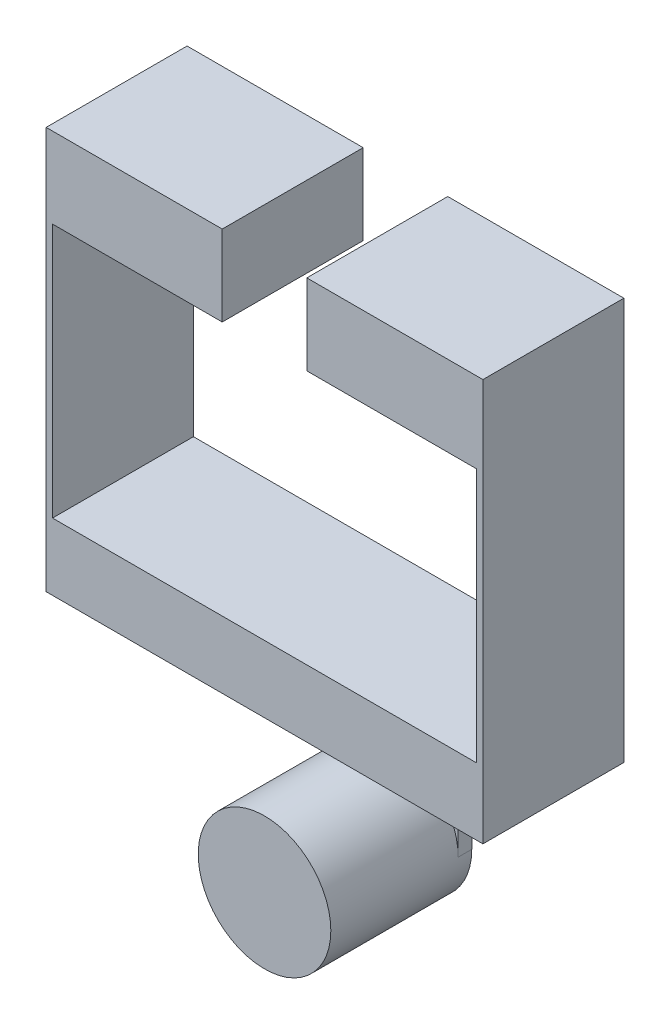
ISO-10303-21;
HEADER;
FILE_DESCRIPTION(('STEP AP214'),'2;1');
FILE_NAME('part.step','',(''),(''),'','','');
FILE_SCHEMA(('AUTOMOTIVE_DESIGN { 1 0 10303 214 1 1 1 1 }'));
ENDSEC;
DATA;
#1=APPLICATION_CONTEXT('core data for automotive mechanical design processes');
#2=APPLICATION_PROTOCOL_DEFINITION('international standard','automotive_design',2000,#1);
#3=PRODUCT_CONTEXT('',#1,'mechanical');
#4=PRODUCT('Part','Part','',(#3));
#5=PRODUCT_RELATED_PRODUCT_CATEGORY('part','',(#4));
#6=PRODUCT_DEFINITION_FORMATION('','',#4);
#7=PRODUCT_DEFINITION_CONTEXT('part definition',#1,'design');
#8=PRODUCT_DEFINITION('design','',#6,#7);
#9=PRODUCT_DEFINITION_SHAPE('','',#8);
#10=(LENGTH_UNIT() NAMED_UNIT(*) SI_UNIT(.MILLI.,.METRE.));
#11=(NAMED_UNIT(*) PLANE_ANGLE_UNIT() SI_UNIT($,.RADIAN.));
#12=(NAMED_UNIT(*) SI_UNIT($,.STERADIAN.) SOLID_ANGLE_UNIT());
#13=UNCERTAINTY_MEASURE_WITH_UNIT(LENGTH_MEASURE(1.E-05),#10,'distance_accuracy_value','');
#14=(GEOMETRIC_REPRESENTATION_CONTEXT(3) GLOBAL_UNCERTAINTY_ASSIGNED_CONTEXT((#13)) GLOBAL_UNIT_ASSIGNED_CONTEXT((#10,
#11,#12)) REPRESENTATION_CONTEXT('',''));
#15=CARTESIAN_POINT('',(0.,0.,0.));
#16=DIRECTION('',(0.,0.,1.));
#17=DIRECTION('',(1.,0.,0.));
#18=AXIS2_PLACEMENT_3D('',#15,#16,#17);
#19=CARTESIAN_POINT('',(-31.70428,70.7017928379302,0.));
#20=DIRECTION('',(-1.,0.,0.));
#21=DIRECTION('',(0.,0.,1.));
#22=AXIS2_PLACEMENT_3D('',#19,#20,#21);
#23=PLANE('',#22);
#24=DIRECTION('',(0.,0.,-1.));
#25=VECTOR('',#24,1.);
#26=CARTESIAN_POINT('',(-31.70428,70.7017928379302,0.));
#27=LINE('',#26,#25);
#28=CARTESIAN_POINT('',(-31.70428,70.7017928379302,21.0747443563726));
#29=VERTEX_POINT('',#28);
#30=CARTESIAN_POINT('',(-31.70428,70.7017928379302,0.));
#31=VERTEX_POINT('',#30);
#32=EDGE_CURVE('E65',#29,#31,#27,.T.);
#33=ORIENTED_EDGE('',*,*,#32,.F.);
#34=DIRECTION('',(0.,-1.,0.));
#35=VECTOR('',#34,1.);
#36=CARTESIAN_POINT('',(-31.70428,70.7017928379302,21.0747443563726));
#37=LINE('',#36,#35);
#38=CARTESIAN_POINT('',(-31.70428,32.6271928379302,21.0747443563726));
#39=VERTEX_POINT('',#38);
#40=EDGE_CURVE('E186',#29,#39,#37,.T.);
#41=ORIENTED_EDGE('',*,*,#40,.T.);
#42=DIRECTION('',(0.,0.,-1.));
#43=VECTOR('',#42,1.);
#44=CARTESIAN_POINT('',(-31.70428,32.6271928379302,0.));
#45=LINE('',#44,#43);
#46=CARTESIAN_POINT('',(-31.70428,32.6271928379302,0.));
#47=VERTEX_POINT('',#46);
#48=EDGE_CURVE('E203',#39,#47,#45,.T.);
#49=ORIENTED_EDGE('',*,*,#48,.T.);
#50=DIRECTION('',(0.,-1.,0.));
#51=VECTOR('',#50,1.);
#52=CARTESIAN_POINT('',(-31.70428,70.7017928379302,0.));
#53=LINE('',#52,#51);
#54=EDGE_CURVE('E70',#31,#47,#53,.T.);
#55=ORIENTED_EDGE('',*,*,#54,.F.);
#56=EDGE_LOOP('',(#33,#41,#49,#55));
#57=FACE_BOUND('',#56,.T.);
#58=ADVANCED_FACE('F49',(#57),#23,.F.);
#59=CARTESIAN_POINT('',(0.,32.6271928379302,0.));
#60=DIRECTION('',(0.,1.,0.));
#61=DIRECTION('',(0.,0.,1.));
#62=AXIS2_PLACEMENT_3D('',#59,#60,#61);
#63=PLANE('',#62);
#64=DIRECTION('',(-1.,0.,0.));
#65=VECTOR('',#64,1.);
#66=CARTESIAN_POINT('',(-31.70428,32.6271928379302,0.));
#67=LINE('',#66,#65);
#68=CARTESIAN_POINT('',(31.70428,32.6271928379302,0.));
#69=VERTEX_POINT('',#68);
#70=EDGE_CURVE('E280',#69,#47,#67,.T.);
#71=ORIENTED_EDGE('',*,*,#70,.T.);
#72=ORIENTED_EDGE('',*,*,#48,.F.);
#73=DIRECTION('',(1.,0.,0.));
#74=VECTOR('',#73,1.);
#75=CARTESIAN_POINT('',(-31.70428,32.6271928379302,21.0747443563726));
#76=LINE('',#75,#74);
#77=CARTESIAN_POINT('',(31.70428,32.6271928379302,21.0747443563726));
#78=VERTEX_POINT('',#77);
#79=EDGE_CURVE('E284',#39,#78,#76,.T.);
#80=ORIENTED_EDGE('',*,*,#79,.T.);
#81=DIRECTION('',(0.,0.,-1.));
#82=VECTOR('',#81,1.);
#83=CARTESIAN_POINT('',(31.70428,32.6271928379302,0.));
#84=LINE('',#83,#82);
#85=EDGE_CURVE('E258',#78,#69,#84,.T.);
#86=ORIENTED_EDGE('',*,*,#85,.T.);
#87=EDGE_LOOP('',(#71,#72,#80,#86));
#88=FACE_BOUND('',#87,.T.);
#89=ADVANCED_FACE('F449',(#88),#63,.T.);
#90=CARTESIAN_POINT('',(0.,0.,21.0747443563726));
#91=DIRECTION('',(0.,0.,-1.));
#92=DIRECTION('',(-1.,0.,0.));
#93=AXIS2_PLACEMENT_3D('',#90,#91,#92);
#94=CYLINDRICAL_SURFACE('',#93,9.91317465894993);
#95=CARTESIAN_POINT('',(0.,0.,21.0747443563726));
#96=DIRECTION('',(0.,0.,1.));
#97=DIRECTION('',(1.,0.,0.));
#98=AXIS2_PLACEMENT_3D('',#95,#96,#97);
#99=CIRCLE('',#98,9.91317465894993);
#100=CARTESIAN_POINT('',(9.91317465894993,0.,21.0747443563726));
#101=VERTEX_POINT('',#100);
#102=EDGE_CURVE('E58',#101,#101,#99,.T.);
#103=ORIENTED_EDGE('',*,*,#102,.F.);
#104=EDGE_LOOP('',(#103));
#105=FACE_BOUND('',#104,.T.);
#106=CARTESIAN_POINT('',(0.,0.,2.02474435637258));
#107=DIRECTION('',(0.,0.,-1.));
#108=DIRECTION('',(-1.,0.,0.));
#109=AXIS2_PLACEMENT_3D('',#106,#107,#108);
#110=CIRCLE('',#109,9.91317465894993);
#111=CARTESIAN_POINT('',(-9.91317465894993,0.,2.02474435637258));
#112=VERTEX_POINT('',#111);
#113=CARTESIAN_POINT('',(9.91317465894993,0.,2.02474435637258));
#114=VERTEX_POINT('',#113);
#115=EDGE_CURVE('E11',#112,#114,#110,.T.);
#116=ORIENTED_EDGE('',*,*,#115,.F.);
#117=DIRECTION('',(0.,0.,-1.));
#118=VECTOR('',#117,1.);
#119=CARTESIAN_POINT('',(-9.91317465894993,0.,2.02474435637258));
#120=LINE('',#119,#118);
#121=CARTESIAN_POINT('',(-9.91317465894993,0.,0.));
#122=VERTEX_POINT('',#121);
#123=EDGE_CURVE('E322',#112,#122,#120,.T.);
#124=ORIENTED_EDGE('',*,*,#123,.T.);
#125=CARTESIAN_POINT('',(0.,0.,0.));
#126=DIRECTION('',(0.,0.,1.));
#127=DIRECTION('',(1.,0.,0.));
#128=AXIS2_PLACEMENT_3D('',#125,#126,#127);
#129=CIRCLE('',#128,9.91317465894993);
#130=CARTESIAN_POINT('',(9.91317465894993,0.,0.));
#131=VERTEX_POINT('',#130);
#132=EDGE_CURVE('E318',#122,#131,#129,.T.);
#133=ORIENTED_EDGE('',*,*,#132,.T.);
#134=DIRECTION('',(0.,0.,-1.));
#135=VECTOR('',#134,1.);
#136=CARTESIAN_POINT('',(9.91317465894993,0.,2.02474435637258));
#137=LINE('',#136,#135);
#138=EDGE_CURVE('E307',#114,#131,#137,.T.);
#139=ORIENTED_EDGE('',*,*,#138,.F.);
#140=EDGE_LOOP('',(#116,#124,#133,#139));
#141=FACE_BOUND('',#140,.T.);
#142=ADVANCED_FACE('F51',(#105,#141),#94,.T.);
#143=CARTESIAN_POINT('',(0.,0.,21.0747443563726));
#144=DIRECTION('',(0.,0.,1.));
#145=DIRECTION('',(1.,0.,0.));
#146=AXIS2_PLACEMENT_3D('',#143,#144,#145);
#147=PLANE('',#146);
#148=ORIENTED_EDGE('',*,*,#102,.T.);
#149=EDGE_LOOP('',(#148));
#150=FACE_BOUND('',#149,.T.);
#151=ADVANCED_FACE('F487',(#150),#147,.T.);
#152=CARTESIAN_POINT('',(0.,0.,0.));
#153=DIRECTION('',(0.,0.,1.));
#154=DIRECTION('',(1.,0.,0.));
#155=AXIS2_PLACEMENT_3D('',#152,#153,#154);
#156=PLANE('',#155);
#157=DIRECTION('',(-1.,0.,0.));
#158=VECTOR('',#157,1.);
#159=CARTESIAN_POINT('',(-31.70428,22.6131746589499,0.));
#160=LINE('',#159,#158);
#161=CARTESIAN_POINT('',(-9.91317465894993,22.6131746589499,0.));
#162=VERTEX_POINT('',#161);
#163=CARTESIAN_POINT('',(-32.6566827482865,22.6131746589499,0.));
#164=VERTEX_POINT('',#163);
#165=EDGE_CURVE('E274',#162,#164,#160,.T.);
#166=ORIENTED_EDGE('',*,*,#165,.T.);
#167=DIRECTION('',(0.,1.,0.));
#168=VECTOR('',#167,1.);
#169=CARTESIAN_POINT('',(-32.6566827482865,1.51692094694216,0.));
#170=LINE('',#169,#168);
#171=CARTESIAN_POINT('',(-32.6566827482865,82.7446356043119,0.));
#172=VERTEX_POINT('',#171);
#173=EDGE_CURVE('E218',#164,#172,#170,.T.);
#174=ORIENTED_EDGE('',*,*,#173,.T.);
#175=DIRECTION('',(1.,0.,0.));
#176=VECTOR('',#175,1.);
#177=CARTESIAN_POINT('',(-120.338168232913,82.7446356043119,0.));
#178=LINE('',#177,#176);
#179=CARTESIAN_POINT('',(-6.32460000000002,82.7446356043119,0.));
#180=VERTEX_POINT('',#179);
#181=EDGE_CURVE('E188',#172,#180,#178,.T.);
#182=ORIENTED_EDGE('',*,*,#181,.T.);
#183=DIRECTION('',(0.,1.,0.));
#184=VECTOR('',#183,1.);
#185=CARTESIAN_POINT('',(-6.32460000000002,0.,-2.53492376288285E-13));
#186=LINE('',#185,#184);
#187=CARTESIAN_POINT('',(-6.32460000000002,70.7017928379302,0.));
#188=VERTEX_POINT('',#187);
#189=EDGE_CURVE('E172',#188,#180,#186,.T.);
#190=ORIENTED_EDGE('',*,*,#189,.F.);
#191=DIRECTION('',(-1.,0.,0.));
#192=VECTOR('',#191,1.);
#193=CARTESIAN_POINT('',(-6.32460000000002,70.7017928379302,0.));
#194=LINE('',#193,#192);
#195=EDGE_CURVE('E167',#188,#31,#194,.T.);
#196=ORIENTED_EDGE('',*,*,#195,.T.);
#197=ORIENTED_EDGE('',*,*,#54,.T.);
#198=ORIENTED_EDGE('',*,*,#70,.F.);
#199=DIRECTION('',(0.,-1.,0.));
#200=VECTOR('',#199,1.);
#201=CARTESIAN_POINT('',(31.70428,70.7017928379302,0.));
#202=LINE('',#201,#200);
#203=CARTESIAN_POINT('',(31.70428,70.7017928379302,0.));
#204=VERTEX_POINT('',#203);
#205=EDGE_CURVE('E266',#204,#69,#202,.T.);
#206=ORIENTED_EDGE('',*,*,#205,.F.);
#207=DIRECTION('',(1.,0.,0.));
#208=VECTOR('',#207,1.);
#209=CARTESIAN_POINT('',(6.32460000000002,70.7017928379302,0.));
#210=LINE('',#209,#208);
#211=CARTESIAN_POINT('',(6.32460000000002,70.7017928379302,0.));
#212=VERTEX_POINT('',#211);
#213=EDGE_CURVE('E245',#212,#204,#210,.T.);
#214=ORIENTED_EDGE('',*,*,#213,.F.);
#215=DIRECTION('',(0.,1.,0.));
#216=VECTOR('',#215,1.);
#217=CARTESIAN_POINT('',(6.32460000000002,0.,-2.53492376288285E-13));
#218=LINE('',#217,#216);
#219=CARTESIAN_POINT('',(6.32460000000002,82.7446356043119,0.));
#220=VERTEX_POINT('',#219);
#221=EDGE_CURVE('E231',#212,#220,#218,.T.);
#222=ORIENTED_EDGE('',*,*,#221,.T.);
#223=DIRECTION('',(-1.,0.,0.));
#224=VECTOR('',#223,1.);
#225=CARTESIAN_POINT('',(56.9296082329133,82.7446356043119,0.));
#226=LINE('',#225,#224);
#227=CARTESIAN_POINT('',(32.6566827482865,82.7446356043119,0.));
#228=VERTEX_POINT('',#227);
#229=EDGE_CURVE('E249',#228,#220,#226,.T.);
#230=ORIENTED_EDGE('',*,*,#229,.F.);
#231=DIRECTION('',(0.,1.,0.));
#232=VECTOR('',#231,1.);
#233=CARTESIAN_POINT('',(32.6566827482865,1.51692094694216,0.));
#234=LINE('',#233,#232);
#235=CARTESIAN_POINT('',(32.6566827482865,22.6131746589499,0.));
#236=VERTEX_POINT('',#235);
#237=EDGE_CURVE('E269',#236,#228,#234,.T.);
#238=ORIENTED_EDGE('',*,*,#237,.F.);
#239=CARTESIAN_POINT('',(9.91317465894993,22.6131746589499,0.));
#240=VERTEX_POINT('',#239);
#241=EDGE_CURVE('E289',#236,#240,#160,.T.);
#242=ORIENTED_EDGE('',*,*,#241,.T.);
#243=DIRECTION('',(0.,-1.,0.));
#244=VECTOR('',#243,1.);
#245=CARTESIAN_POINT('',(9.91317465894993,22.6131746589499,0.));
#246=LINE('',#245,#244);
#247=EDGE_CURVE('E288',#240,#131,#246,.T.);
#248=ORIENTED_EDGE('',*,*,#247,.T.);
#249=ORIENTED_EDGE('',*,*,#132,.F.);
#250=DIRECTION('',(0.,1.,0.));
#251=VECTOR('',#250,1.);
#252=CARTESIAN_POINT('',(-9.91317465894993,0.,0.));
#253=LINE('',#252,#251);
#254=EDGE_CURVE('E300',#122,#162,#253,.T.);
#255=ORIENTED_EDGE('',*,*,#254,.T.);
#256=EDGE_LOOP('',(#166,#174,#182,#190,#196,#197,#198,#206,#214,#222,#230,#238,#242,#248,#249,#255));
#257=FACE_BOUND('',#256,.T.);
#258=ADVANCED_FACE('F341',(#257),#156,.F.);
#259=CARTESIAN_POINT('',(9.91317465894993,22.6131746589499,2.02474435637258));
#260=DIRECTION('',(1.,0.,0.));
#261=DIRECTION('',(0.,1.,0.));
#262=AXIS2_PLACEMENT_3D('',#259,#260,#261);
#263=PLANE('',#262);
#264=ORIENTED_EDGE('',*,*,#247,.F.);
#265=DIRECTION('',(0.,0.,-1.));
#266=VECTOR('',#265,1.);
#267=CARTESIAN_POINT('',(9.91317465894993,22.6131746589499,2.02474435637258));
#268=LINE('',#267,#266);
#269=CARTESIAN_POINT('',(9.91317465894993,22.6131746589499,2.02474435637258));
#270=VERTEX_POINT('',#269);
#271=EDGE_CURVE('E314',#270,#240,#268,.T.);
#272=ORIENTED_EDGE('',*,*,#271,.F.);
#273=DIRECTION('',(0.,-1.,0.));
#274=VECTOR('',#273,1.);
#275=CARTESIAN_POINT('',(9.91317465894993,22.6131746589499,2.02474435637258));
#276=LINE('',#275,#274);
#277=EDGE_CURVE('E295',#270,#114,#276,.T.);
#278=ORIENTED_EDGE('',*,*,#277,.T.);
#279=ORIENTED_EDGE('',*,*,#138,.T.);
#280=EDGE_LOOP('',(#264,#272,#278,#279));
#281=FACE_BOUND('',#280,.T.);
#282=ADVANCED_FACE('F339',(#281),#263,.T.);
#283=CARTESIAN_POINT('',(-9.91317465894993,0.,2.02474435637258));
#284=DIRECTION('',(-1.,0.,0.));
#285=DIRECTION('',(0.,-1.,0.));
#286=AXIS2_PLACEMENT_3D('',#283,#284,#285);
#287=PLANE('',#286);
#288=ORIENTED_EDGE('',*,*,#254,.F.);
#289=ORIENTED_EDGE('',*,*,#123,.F.);
#290=DIRECTION('',(0.,1.,0.));
#291=VECTOR('',#290,1.);
#292=CARTESIAN_POINT('',(-9.91317465894993,0.,2.02474435637258));
#293=LINE('',#292,#291);
#294=CARTESIAN_POINT('',(-9.91317465894993,22.6131746589499,2.02474435637258));
#295=VERTEX_POINT('',#294);
#296=EDGE_CURVE('E299',#112,#295,#293,.T.);
#297=ORIENTED_EDGE('',*,*,#296,.T.);
#298=DIRECTION('',(0.,0.,-1.));
#299=VECTOR('',#298,1.);
#300=CARTESIAN_POINT('',(-9.91317465894993,22.6131746589499,2.02474435637258));
#301=LINE('',#300,#299);
#302=EDGE_CURVE('E319',#295,#162,#301,.T.);
#303=ORIENTED_EDGE('',*,*,#302,.T.);
#304=EDGE_LOOP('',(#288,#289,#297,#303));
#305=FACE_BOUND('',#304,.T.);
#306=ADVANCED_FACE('F480',(#305),#287,.T.);
#307=CARTESIAN_POINT('',(0.,0.,2.02474435637258));
#308=DIRECTION('',(0.,0.,-1.));
#309=DIRECTION('',(-1.,0.,0.));
#310=AXIS2_PLACEMENT_3D('',#307,#308,#309);
#311=PLANE('',#310);
#312=ORIENTED_EDGE('',*,*,#296,.F.);
#313=ORIENTED_EDGE('',*,*,#115,.T.);
#314=ORIENTED_EDGE('',*,*,#277,.F.);
#315=DIRECTION('',(1.,0.,0.));
#316=VECTOR('',#315,1.);
#317=CARTESIAN_POINT('',(-9.91317465894993,22.6131746589499,2.02474435637258));
#318=LINE('',#317,#316);
#319=EDGE_CURVE('E303',#295,#270,#318,.T.);
#320=ORIENTED_EDGE('',*,*,#319,.F.);
#321=EDGE_LOOP('',(#312,#313,#314,#320));
#322=FACE_BOUND('',#321,.T.);
#323=ADVANCED_FACE('F477',(#322),#311,.F.);
#324=CARTESIAN_POINT('',(-31.70428,32.6271928379302,21.0747443563726));
#325=DIRECTION('',(0.,0.,-1.));
#326=DIRECTION('',(-1.,0.,0.));
#327=AXIS2_PLACEMENT_3D('',#324,#325,#326);
#328=PLANE('',#327);
#329=ORIENTED_EDGE('',*,*,#79,.F.);
#330=ORIENTED_EDGE('',*,*,#40,.F.);
#331=DIRECTION('',(-1.,0.,0.));
#332=VECTOR('',#331,1.);
#333=CARTESIAN_POINT('',(-6.32460000000001,70.7017928379302,21.0747443563726));
#334=LINE('',#333,#332);
#335=CARTESIAN_POINT('',(-6.32460000000001,70.7017928379302,21.0747443563726));
#336=VERTEX_POINT('',#335);
#337=EDGE_CURVE('E165',#336,#29,#334,.T.);
#338=ORIENTED_EDGE('',*,*,#337,.F.);
#339=DIRECTION('',(0.,-1.,0.));
#340=VECTOR('',#339,1.);
#341=CARTESIAN_POINT('',(-6.32460000000001,0.,21.0747443563726));
#342=LINE('',#341,#340);
#343=CARTESIAN_POINT('',(-6.32460000000001,82.7446356043119,21.0747443563726));
#344=VERTEX_POINT('',#343);
#345=EDGE_CURVE('E173',#344,#336,#342,.T.);
#346=ORIENTED_EDGE('',*,*,#345,.F.);
#347=DIRECTION('',(1.,0.,0.));
#348=VECTOR('',#347,1.);
#349=CARTESIAN_POINT('',(-120.338168232913,82.7446356043119,21.0747443563726));
#350=LINE('',#349,#348);
#351=CARTESIAN_POINT('',(-32.6566827482865,82.7446356043119,21.0747443563726));
#352=VERTEX_POINT('',#351);
#353=EDGE_CURVE('E194',#352,#344,#350,.T.);
#354=ORIENTED_EDGE('',*,*,#353,.F.);
#355=DIRECTION('',(0.,1.,0.));
#356=VECTOR('',#355,1.);
#357=CARTESIAN_POINT('',(-32.6566827482865,1.51692094694216,21.0747443563726));
#358=LINE('',#357,#356);
#359=CARTESIAN_POINT('',(-32.6566827482865,22.6131746589499,21.0747443563726));
#360=VERTEX_POINT('',#359);
#361=EDGE_CURVE('E212',#360,#352,#358,.T.);
#362=ORIENTED_EDGE('',*,*,#361,.F.);
#363=DIRECTION('',(1.,0.,0.));
#364=VECTOR('',#363,1.);
#365=CARTESIAN_POINT('',(-31.70428,22.6131746589499,21.0747443563726));
#366=LINE('',#365,#364);
#367=CARTESIAN_POINT('',(32.6566827482865,22.6131746589499,21.0747443563726));
#368=VERTEX_POINT('',#367);
#369=EDGE_CURVE('E285',#360,#368,#366,.T.);
#370=ORIENTED_EDGE('',*,*,#369,.T.);
#371=DIRECTION('',(0.,1.,0.));
#372=VECTOR('',#371,1.);
#373=CARTESIAN_POINT('',(32.6566827482865,1.51692094694216,21.0747443563726));
#374=LINE('',#373,#372);
#375=CARTESIAN_POINT('',(32.6566827482865,82.7446356043119,21.0747443563726));
#376=VERTEX_POINT('',#375);
#377=EDGE_CURVE('E275',#368,#376,#374,.T.);
#378=ORIENTED_EDGE('',*,*,#377,.T.);
#379=DIRECTION('',(-1.,0.,0.));
#380=VECTOR('',#379,1.);
#381=CARTESIAN_POINT('',(56.9296082329133,82.7446356043119,21.0747443563726));
#382=LINE('',#381,#380);
#383=CARTESIAN_POINT('',(6.32460000000001,82.7446356043119,21.0747443563726));
#384=VERTEX_POINT('',#383);
#385=EDGE_CURVE('E248',#376,#384,#382,.T.);
#386=ORIENTED_EDGE('',*,*,#385,.T.);
#387=DIRECTION('',(0.,-1.,0.));
#388=VECTOR('',#387,1.);
#389=CARTESIAN_POINT('',(6.32460000000001,0.,21.0747443563726));
#390=LINE('',#389,#388);
#391=CARTESIAN_POINT('',(6.32460000000001,70.7017928379302,21.0747443563726));
#392=VERTEX_POINT('',#391);
#393=EDGE_CURVE('E223',#384,#392,#390,.T.);
#394=ORIENTED_EDGE('',*,*,#393,.T.);
#395=DIRECTION('',(1.,0.,0.));
#396=VECTOR('',#395,1.);
#397=CARTESIAN_POINT('',(6.32460000000001,70.7017928379302,21.0747443563726));
#398=LINE('',#397,#396);
#399=CARTESIAN_POINT('',(31.70428,70.7017928379302,21.0747443563726));
#400=VERTEX_POINT('',#399);
#401=EDGE_CURVE('E239',#392,#400,#398,.T.);
#402=ORIENTED_EDGE('',*,*,#401,.T.);
#403=DIRECTION('',(0.,-1.,0.));
#404=VECTOR('',#403,1.);
#405=CARTESIAN_POINT('',(31.70428,70.7017928379302,21.0747443563726));
#406=LINE('',#405,#404);
#407=EDGE_CURVE('E262',#400,#78,#406,.T.);
#408=ORIENTED_EDGE('',*,*,#407,.T.);
#409=EDGE_LOOP('',(#329,#330,#338,#346,#354,#362,#370,#378,#386,#394,#402,#408));
#410=FACE_BOUND('',#409,.T.);
#411=ADVANCED_FACE('F185',(#410),#328,.F.);
#412=CARTESIAN_POINT('',(0.,22.6131746589499,0.));
#413=DIRECTION('',(0.,1.,0.));
#414=DIRECTION('',(0.,0.,1.));
#415=AXIS2_PLACEMENT_3D('',#412,#413,#414);
#416=PLANE('',#415);
#417=DIRECTION('',(0.,0.,-1.));
#418=VECTOR('',#417,1.);
#419=CARTESIAN_POINT('',(32.6566827482865,22.6131746589499,0.));
#420=LINE('',#419,#418);
#421=EDGE_CURVE('E270',#368,#236,#420,.T.);
#422=ORIENTED_EDGE('',*,*,#421,.F.);
#423=ORIENTED_EDGE('',*,*,#369,.F.);
#424=DIRECTION('',(0.,0.,-1.));
#425=VECTOR('',#424,1.);
#426=CARTESIAN_POINT('',(-32.6566827482865,22.6131746589499,0.));
#427=LINE('',#426,#425);
#428=EDGE_CURVE('E213',#360,#164,#427,.T.);
#429=ORIENTED_EDGE('',*,*,#428,.T.);
#430=ORIENTED_EDGE('',*,*,#165,.F.);
#431=ORIENTED_EDGE('',*,*,#302,.F.);
#432=ORIENTED_EDGE('',*,*,#319,.T.);
#433=ORIENTED_EDGE('',*,*,#271,.T.);
#434=ORIENTED_EDGE('',*,*,#241,.F.);
#435=EDGE_LOOP('',(#422,#423,#429,#430,#431,#432,#433,#434));
#436=FACE_BOUND('',#435,.T.);
#437=ADVANCED_FACE('F346',(#436),#416,.F.);
#438=CARTESIAN_POINT('',(32.6566827482865,1.51692094694216,0.));
#439=DIRECTION('',(-1.,0.,0.));
#440=DIRECTION('',(0.,0.,1.));
#441=AXIS2_PLACEMENT_3D('',#438,#439,#440);
#442=PLANE('',#441);
#443=ORIENTED_EDGE('',*,*,#377,.F.);
#444=ORIENTED_EDGE('',*,*,#421,.T.);
#445=ORIENTED_EDGE('',*,*,#237,.T.);
#446=DIRECTION('',(0.,0.,-1.));
#447=VECTOR('',#446,1.);
#448=CARTESIAN_POINT('',(32.6566827482865,82.7446356043119,0.));
#449=LINE('',#448,#447);
#450=EDGE_CURVE('E252',#376,#228,#449,.T.);
#451=ORIENTED_EDGE('',*,*,#450,.F.);
#452=EDGE_LOOP('',(#443,#444,#445,#451));
#453=FACE_BOUND('',#452,.T.);
#454=ADVANCED_FACE('F349',(#453),#442,.F.);
#455=CARTESIAN_POINT('',(31.70428,70.7017928379302,0.));
#456=DIRECTION('',(-1.,0.,0.));
#457=DIRECTION('',(0.,0.,1.));
#458=AXIS2_PLACEMENT_3D('',#455,#456,#457);
#459=PLANE('',#458);
#460=DIRECTION('',(0.,0.,-1.));
#461=VECTOR('',#460,1.);
#462=CARTESIAN_POINT('',(31.70428,70.7017928379302,0.));
#463=LINE('',#462,#461);
#464=EDGE_CURVE('E217',#400,#204,#463,.T.);
#465=ORIENTED_EDGE('',*,*,#464,.T.);
#466=ORIENTED_EDGE('',*,*,#205,.T.);
#467=ORIENTED_EDGE('',*,*,#85,.F.);
#468=ORIENTED_EDGE('',*,*,#407,.F.);
#469=EDGE_LOOP('',(#465,#466,#467,#468));
#470=FACE_BOUND('',#469,.T.);
#471=ADVANCED_FACE('F467',(#470),#459,.T.);
#472=CARTESIAN_POINT('',(56.9296082329133,82.7446356043119,0.));
#473=DIRECTION('',(0.,-1.,0.));
#474=DIRECTION('',(0.,0.,-1.));
#475=AXIS2_PLACEMENT_3D('',#472,#473,#474);
#476=PLANE('',#475);
#477=ORIENTED_EDGE('',*,*,#385,.F.);
#478=ORIENTED_EDGE('',*,*,#450,.T.);
#479=ORIENTED_EDGE('',*,*,#229,.T.);
#480=DIRECTION('',(0.,0.,1.));
#481=VECTOR('',#480,1.);
#482=CARTESIAN_POINT('',(6.32460000000002,82.7446356043119,0.));
#483=LINE('',#482,#481);
#484=EDGE_CURVE('E227',#220,#384,#483,.T.);
#485=ORIENTED_EDGE('',*,*,#484,.T.);
#486=EDGE_LOOP('',(#477,#478,#479,#485));
#487=FACE_BOUND('',#486,.T.);
#488=ADVANCED_FACE('F463',(#487),#476,.F.);
#489=CARTESIAN_POINT('',(6.32460000000002,70.7017928379302,0.));
#490=DIRECTION('',(0.,-1.,0.));
#491=DIRECTION('',(0.,0.,-1.));
#492=AXIS2_PLACEMENT_3D('',#489,#490,#491);
#493=PLANE('',#492);
#494=ORIENTED_EDGE('',*,*,#464,.F.);
#495=ORIENTED_EDGE('',*,*,#401,.F.);
#496=DIRECTION('',(0.,0.,-1.));
#497=VECTOR('',#496,1.);
#498=CARTESIAN_POINT('',(6.32460000000002,70.7017928379302,0.));
#499=LINE('',#498,#497);
#500=EDGE_CURVE('E235',#392,#212,#499,.T.);
#501=ORIENTED_EDGE('',*,*,#500,.T.);
#502=ORIENTED_EDGE('',*,*,#213,.T.);
#503=EDGE_LOOP('',(#494,#495,#501,#502));
#504=FACE_BOUND('',#503,.T.);
#505=ADVANCED_FACE('F459',(#504),#493,.T.);
#506=CARTESIAN_POINT('',(6.32460000000002,0.,0.));
#507=DIRECTION('',(-1.,0.,0.));
#508=DIRECTION('',(0.,0.,1.));
#509=AXIS2_PLACEMENT_3D('',#506,#507,#508);
#510=PLANE('',#509);
#511=ORIENTED_EDGE('',*,*,#393,.F.);
#512=ORIENTED_EDGE('',*,*,#484,.F.);
#513=ORIENTED_EDGE('',*,*,#221,.F.);
#514=ORIENTED_EDGE('',*,*,#500,.F.);
#515=EDGE_LOOP('',(#511,#512,#513,#514));
#516=FACE_BOUND('',#515,.T.);
#517=ADVANCED_FACE('F445',(#516),#510,.T.);
#518=CARTESIAN_POINT('',(-32.6566827482865,1.51692094694216,0.));
#519=DIRECTION('',(-1.,0.,0.));
#520=DIRECTION('',(0.,0.,1.));
#521=AXIS2_PLACEMENT_3D('',#518,#519,#520);
#522=PLANE('',#521);
#523=ORIENTED_EDGE('',*,*,#361,.T.);
#524=DIRECTION('',(0.,0.,-1.));
#525=VECTOR('',#524,1.);
#526=CARTESIAN_POINT('',(-32.6566827482865,82.7446356043119,0.));
#527=LINE('',#526,#525);
#528=EDGE_CURVE('E199',#352,#172,#527,.T.);
#529=ORIENTED_EDGE('',*,*,#528,.T.);
#530=ORIENTED_EDGE('',*,*,#173,.F.);
#531=ORIENTED_EDGE('',*,*,#428,.F.);
#532=EDGE_LOOP('',(#523,#529,#530,#531));
#533=FACE_BOUND('',#532,.T.);
#534=ADVANCED_FACE('F358',(#533),#522,.T.);
#535=CARTESIAN_POINT('',(-120.338168232913,82.7446356043119,0.));
#536=DIRECTION('',(0.,1.,0.));
#537=DIRECTION('',(0.,0.,1.));
#538=AXIS2_PLACEMENT_3D('',#535,#536,#537);
#539=PLANE('',#538);
#540=ORIENTED_EDGE('',*,*,#528,.F.);
#541=ORIENTED_EDGE('',*,*,#353,.T.);
#542=DIRECTION('',(0.,0.,1.));
#543=VECTOR('',#542,1.);
#544=CARTESIAN_POINT('',(-6.32460000000002,82.7446356043119,0.));
#545=LINE('',#544,#543);
#546=EDGE_CURVE('E179',#180,#344,#545,.T.);
#547=ORIENTED_EDGE('',*,*,#546,.F.);
#548=ORIENTED_EDGE('',*,*,#181,.F.);
#549=EDGE_LOOP('',(#540,#541,#547,#548));
#550=FACE_BOUND('',#549,.T.);
#551=ADVANCED_FACE('F436',(#550),#539,.T.);
#552=CARTESIAN_POINT('',(-6.32460000000002,70.7017928379302,0.));
#553=DIRECTION('',(0.,1.,0.));
#554=DIRECTION('',(0.,0.,1.));
#555=AXIS2_PLACEMENT_3D('',#552,#553,#554);
#556=PLANE('',#555);
#557=ORIENTED_EDGE('',*,*,#32,.T.);
#558=ORIENTED_EDGE('',*,*,#195,.F.);
#559=DIRECTION('',(0.,0.,-1.));
#560=VECTOR('',#559,1.);
#561=CARTESIAN_POINT('',(-6.32460000000002,70.7017928379302,0.));
#562=LINE('',#561,#560);
#563=EDGE_CURVE('E161',#336,#188,#562,.T.);
#564=ORIENTED_EDGE('',*,*,#563,.F.);
#565=ORIENTED_EDGE('',*,*,#337,.T.);
#566=EDGE_LOOP('',(#557,#558,#564,#565));
#567=FACE_BOUND('',#566,.T.);
#568=ADVANCED_FACE('F163',(#567),#556,.F.);
#569=CARTESIAN_POINT('',(-6.32460000000002,0.,0.));
#570=DIRECTION('',(1.,0.,0.));
#571=DIRECTION('',(0.,0.,1.));
#572=AXIS2_PLACEMENT_3D('',#569,#570,#571);
#573=PLANE('',#572);
#574=ORIENTED_EDGE('',*,*,#345,.T.);
#575=ORIENTED_EDGE('',*,*,#563,.T.);
#576=ORIENTED_EDGE('',*,*,#189,.T.);
#577=ORIENTED_EDGE('',*,*,#546,.T.);
#578=EDGE_LOOP('',(#574,#575,#576,#577));
#579=FACE_BOUND('',#578,.T.);
#580=ADVANCED_FACE('F177',(#579),#573,.T.);
#581=CLOSED_SHELL('',(#58,#89,#142,#151,#258,#282,#306,#323,#411,#437,#454,#471,#488,#505,#517,
#534,#551,#568,#580));
#582=MANIFOLD_SOLID_BREP('B2',#581);
#583=ADVANCED_BREP_SHAPE_REPRESENTATION('',(#18,#582),#14);
#584=SHAPE_DEFINITION_REPRESENTATION(#9,#583);
ENDSEC;
END-ISO-10303-21;
